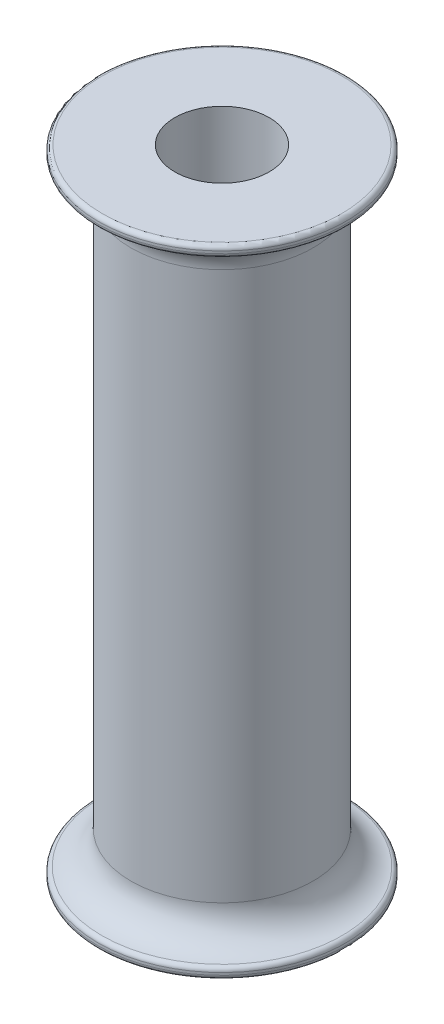
ISO-10303-21;
HEADER;
FILE_DESCRIPTION(('STEP AP214'),'2;1');
FILE_NAME('part.step','',(''),(''),'','','');
FILE_SCHEMA(('AUTOMOTIVE_DESIGN { 1 0 10303 214 1 1 1 1 }'));
ENDSEC;
DATA;
#1=APPLICATION_CONTEXT('core data for automotive mechanical design processes');
#2=APPLICATION_PROTOCOL_DEFINITION('international standard','automotive_design',2000,#1);
#3=PRODUCT_CONTEXT('',#1,'mechanical');
#4=PRODUCT('Part','Part','',(#3));
#5=PRODUCT_RELATED_PRODUCT_CATEGORY('part','',(#4));
#6=PRODUCT_DEFINITION_FORMATION('','',#4);
#7=PRODUCT_DEFINITION_CONTEXT('part definition',#1,'design');
#8=PRODUCT_DEFINITION('design','',#6,#7);
#9=PRODUCT_DEFINITION_SHAPE('','',#8);
#10=(LENGTH_UNIT() NAMED_UNIT(*) SI_UNIT(.MILLI.,.METRE.));
#11=(NAMED_UNIT(*) PLANE_ANGLE_UNIT() SI_UNIT($,.RADIAN.));
#12=(NAMED_UNIT(*) SI_UNIT($,.STERADIAN.) SOLID_ANGLE_UNIT());
#13=UNCERTAINTY_MEASURE_WITH_UNIT(LENGTH_MEASURE(1.E-05),#10,'distance_accuracy_value','');
#14=(GEOMETRIC_REPRESENTATION_CONTEXT(3) GLOBAL_UNCERTAINTY_ASSIGNED_CONTEXT((#13)) GLOBAL_UNIT_ASSIGNED_CONTEXT((#10,
#11,#12)) REPRESENTATION_CONTEXT('',''));
#15=CARTESIAN_POINT('',(0.,0.,0.));
#16=DIRECTION('',(0.,0.,1.));
#17=DIRECTION('',(1.,0.,0.));
#18=AXIS2_PLACEMENT_3D('',#15,#16,#17);
#19=CARTESIAN_POINT('',(0.,12.5,2.15));
#20=DIRECTION('',(0.,-1.,0.));
#21=DIRECTION('',(0.,0.,-1.));
#22=AXIS2_PLACEMENT_3D('',#19,#20,#21);
#23=TOROIDAL_SURFACE('',#22,5.65,1.5);
#24=CARTESIAN_POINT('',(0.,13.9895832073059,2.15));
#25=DIRECTION('',(0.,-1.,0.));
#26=DIRECTION('',(0.,0.,-1.));
#27=AXIS2_PLACEMENT_3D('',#24,#25,#26);
#28=CIRCLE('',#27,5.4735294117647);
#29=CARTESIAN_POINT('',(0.,13.9895832073059,-3.3235294117647));
#30=VERTEX_POINT('',#29);
#31=EDGE_CURVE('E60',#30,#30,#28,.T.);
#32=ORIENTED_EDGE('',*,*,#31,.T.);
#33=EDGE_LOOP('',(#32));
#34=FACE_BOUND('',#33,.T.);
#35=CARTESIAN_POINT('',(0.,12.5,2.15));
#36=DIRECTION('',(0.,-1.,0.));
#37=DIRECTION('',(0.,0.,-1.));
#38=AXIS2_PLACEMENT_3D('',#35,#36,#37);
#39=CIRCLE('',#38,4.15);
#40=CARTESIAN_POINT('',(0.,12.5,-2.));
#41=VERTEX_POINT('',#40);
#42=EDGE_CURVE('E63',#41,#41,#39,.T.);
#43=ORIENTED_EDGE('',*,*,#42,.F.);
#44=EDGE_LOOP('',(#43));
#45=FACE_BOUND('',#44,.T.);
#46=ADVANCED_FACE('F31',(#34,#45),#23,.F.);
#47=CARTESIAN_POINT('',(0.,0.,2.15));
#48=DIRECTION('',(0.,-1.,0.));
#49=DIRECTION('',(0.,0.,-1.));
#50=AXIS2_PLACEMENT_3D('',#47,#48,#49);
#51=CYLINDRICAL_SURFACE('',#50,4.15);
#52=ORIENTED_EDGE('',*,*,#42,.T.);
#53=EDGE_LOOP('',(#52));
#54=FACE_BOUND('',#53,.T.);
#55=CARTESIAN_POINT('',(0.,-12.5,2.15));
#56=DIRECTION('',(0.,-1.,0.));
#57=DIRECTION('',(0.,0.,-1.));
#58=AXIS2_PLACEMENT_3D('',#55,#56,#57);
#59=CIRCLE('',#58,4.15);
#60=CARTESIAN_POINT('',(0.,-12.5,-2.));
#61=VERTEX_POINT('',#60);
#62=EDGE_CURVE('E66',#61,#61,#59,.T.);
#63=ORIENTED_EDGE('',*,*,#62,.F.);
#64=EDGE_LOOP('',(#63));
#65=FACE_BOUND('',#64,.T.);
#66=ADVANCED_FACE('F94',(#54,#65),#51,.T.);
#67=CARTESIAN_POINT('',(0.,-12.5,2.15));
#68=DIRECTION('',(0.,-1.,0.));
#69=DIRECTION('',(0.,0.,-1.));
#70=AXIS2_PLACEMENT_3D('',#67,#68,#69);
#71=TOROIDAL_SURFACE('',#70,5.65,1.5);
#72=CARTESIAN_POINT('',(0.,-13.9895832073058,2.15));
#73=DIRECTION('',(0.,1.,0.));
#74=DIRECTION('',(0.,0.,1.));
#75=AXIS2_PLACEMENT_3D('',#72,#73,#74);
#76=CIRCLE('',#75,5.47352941176473);
#77=CARTESIAN_POINT('',(0.,-13.9895832073058,7.62352941176472));
#78=VERTEX_POINT('',#77);
#79=EDGE_CURVE('E10',#78,#78,#76,.T.);
#80=ORIENTED_EDGE('',*,*,#79,.T.);
#81=EDGE_LOOP('',(#80));
#82=FACE_BOUND('',#81,.T.);
#83=ORIENTED_EDGE('',*,*,#62,.T.);
#84=EDGE_LOOP('',(#83));
#85=FACE_BOUND('',#84,.T.);
#86=ADVANCED_FACE('F100',(#82,#85),#71,.F.);
#87=CARTESIAN_POINT('',(0.,0.,2.15));
#88=DIRECTION('',(0.,-1.,0.));
#89=DIRECTION('',(0.,0.,-1.));
#90=AXIS2_PLACEMENT_3D('',#87,#88,#89);
#91=CYLINDRICAL_SURFACE('',#90,5.65);
#92=CARTESIAN_POINT('',(0.,-14.3,2.15));
#93=DIRECTION('',(0.,-1.,0.));
#94=DIRECTION('',(0.,0.,-1.));
#95=AXIS2_PLACEMENT_3D('',#92,#93,#94);
#96=CIRCLE('',#95,5.65);
#97=CARTESIAN_POINT('',(0.,-14.3,-3.5));
#98=VERTEX_POINT('',#97);
#99=EDGE_CURVE('E38',#98,#98,#96,.F.);
#100=ORIENTED_EDGE('',*,*,#99,.T.);
#101=EDGE_LOOP('',(#100));
#102=FACE_BOUND('',#101,.T.);
#103=CARTESIAN_POINT('',(0.,-14.1881943016134,2.15));
#104=DIRECTION('',(0.,1.,0.));
#105=DIRECTION('',(0.,0.,1.));
#106=AXIS2_PLACEMENT_3D('',#103,#104,#105);
#107=CIRCLE('',#106,5.65);
#108=CARTESIAN_POINT('',(0.,-14.1881943016134,7.8));
#109=VERTEX_POINT('',#108);
#110=EDGE_CURVE('E42',#109,#109,#107,.F.);
#111=ORIENTED_EDGE('',*,*,#110,.T.);
#112=EDGE_LOOP('',(#111));
#113=FACE_BOUND('',#112,.T.);
#114=ADVANCED_FACE('F90',(#102,#113),#91,.T.);
#115=CARTESIAN_POINT('',(0.,-14.5,-3.5));
#116=DIRECTION('',(0.,-1.,0.));
#117=DIRECTION('',(0.,0.,-1.));
#118=AXIS2_PLACEMENT_3D('',#115,#116,#117);
#119=PLANE('',#118);
#120=CARTESIAN_POINT('',(0.,-14.5,2.15));
#121=DIRECTION('',(0.,-1.,0.));
#122=DIRECTION('',(0.,0.,-1.));
#123=AXIS2_PLACEMENT_3D('',#120,#121,#122);
#124=CIRCLE('',#123,5.45);
#125=CARTESIAN_POINT('',(0.,-14.5,-3.3));
#126=VERTEX_POINT('',#125);
#127=EDGE_CURVE('E46',#126,#126,#124,.T.);
#128=ORIENTED_EDGE('',*,*,#127,.T.);
#129=EDGE_LOOP('',(#128));
#130=FACE_BOUND('',#129,.T.);
#131=CARTESIAN_POINT('',(0.,-14.5,2.15));
#132=DIRECTION('',(0.,-1.,0.));
#133=DIRECTION('',(0.,0.,-1.));
#134=AXIS2_PLACEMENT_3D('',#131,#132,#133);
#135=CIRCLE('',#134,2.15);
#136=CARTESIAN_POINT('',(0.,-14.5,0.));
#137=VERTEX_POINT('',#136);
#138=EDGE_CURVE('E69',#137,#137,#135,.T.);
#139=ORIENTED_EDGE('',*,*,#138,.F.);
#140=EDGE_LOOP('',(#139));
#141=FACE_BOUND('',#140,.T.);
#142=ADVANCED_FACE('F80',(#130,#141),#119,.T.);
#143=CARTESIAN_POINT('',(0.,0.,2.15));
#144=DIRECTION('',(0.,-1.,0.));
#145=DIRECTION('',(0.,0.,-1.));
#146=AXIS2_PLACEMENT_3D('',#143,#144,#145);
#147=CYLINDRICAL_SURFACE('',#146,2.15);
#148=ORIENTED_EDGE('',*,*,#138,.T.);
#149=EDGE_LOOP('',(#148));
#150=FACE_BOUND('',#149,.T.);
#151=CARTESIAN_POINT('',(0.,14.5,2.15));
#152=DIRECTION('',(0.,-1.,0.));
#153=DIRECTION('',(0.,0.,-1.));
#154=AXIS2_PLACEMENT_3D('',#151,#152,#153);
#155=CIRCLE('',#154,2.15);
#156=CARTESIAN_POINT('',(0.,14.5,0.));
#157=VERTEX_POINT('',#156);
#158=EDGE_CURVE('E72',#157,#157,#155,.T.);
#159=ORIENTED_EDGE('',*,*,#158,.F.);
#160=EDGE_LOOP('',(#159));
#161=FACE_BOUND('',#160,.T.);
#162=ADVANCED_FACE('F78',(#150,#161),#147,.F.);
#163=CARTESIAN_POINT('',(0.,14.5,-3.5));
#164=DIRECTION('',(0.,1.,0.));
#165=DIRECTION('',(0.,0.,1.));
#166=AXIS2_PLACEMENT_3D('',#163,#164,#165);
#167=PLANE('',#166);
#168=CARTESIAN_POINT('',(0.,14.5,2.15));
#169=DIRECTION('',(0.,1.,0.));
#170=DIRECTION('',(0.,0.,1.));
#171=AXIS2_PLACEMENT_3D('',#168,#169,#170);
#172=CIRCLE('',#171,5.45);
#173=CARTESIAN_POINT('',(0.,14.5,7.6));
#174=VERTEX_POINT('',#173);
#175=EDGE_CURVE('E51',#174,#174,#172,.T.);
#176=ORIENTED_EDGE('',*,*,#175,.T.);
#177=EDGE_LOOP('',(#176));
#178=FACE_BOUND('',#177,.T.);
#179=ORIENTED_EDGE('',*,*,#158,.T.);
#180=EDGE_LOOP('',(#179));
#181=FACE_BOUND('',#180,.T.);
#182=ADVANCED_FACE('F76',(#178,#181),#167,.T.);
#183=CARTESIAN_POINT('',(0.,0.,2.15));
#184=DIRECTION('',(0.,-1.,0.));
#185=DIRECTION('',(0.,0.,-1.));
#186=AXIS2_PLACEMENT_3D('',#183,#184,#185);
#187=CYLINDRICAL_SURFACE('',#186,5.65);
#188=CARTESIAN_POINT('',(0.,14.1881943016134,2.15));
#189=DIRECTION('',(0.,1.,0.));
#190=DIRECTION('',(0.,0.,1.));
#191=AXIS2_PLACEMENT_3D('',#188,#189,#190);
#192=CIRCLE('',#191,5.65);
#193=CARTESIAN_POINT('',(0.,14.1881943016134,7.8));
#194=VERTEX_POINT('',#193);
#195=EDGE_CURVE('E54',#194,#194,#192,.T.);
#196=ORIENTED_EDGE('',*,*,#195,.T.);
#197=EDGE_LOOP('',(#196));
#198=FACE_BOUND('',#197,.T.);
#199=CARTESIAN_POINT('',(0.,14.3,2.15));
#200=DIRECTION('',(0.,1.,0.));
#201=DIRECTION('',(0.,0.,1.));
#202=AXIS2_PLACEMENT_3D('',#199,#200,#201);
#203=CIRCLE('',#202,5.65);
#204=CARTESIAN_POINT('',(0.,14.3,7.8));
#205=VERTEX_POINT('',#204);
#206=EDGE_CURVE('E57',#205,#205,#203,.F.);
#207=ORIENTED_EDGE('',*,*,#206,.T.);
#208=EDGE_LOOP('',(#207));
#209=FACE_BOUND('',#208,.T.);
#210=ADVANCED_FACE('F87',(#198,#209),#187,.T.);
#211=CARTESIAN_POINT('',(0.,14.1881943016134,2.15));
#212=DIRECTION('',(0.,1.,0.));
#213=DIRECTION('',(0.,0.,1.));
#214=AXIS2_PLACEMENT_3D('',#211,#212,#213);
#215=TOROIDAL_SURFACE('',#214,5.45,0.2);
#216=ORIENTED_EDGE('',*,*,#195,.F.);
#217=EDGE_LOOP('',(#216));
#218=FACE_BOUND('',#217,.T.);
#219=ORIENTED_EDGE('',*,*,#31,.F.);
#220=EDGE_LOOP('',(#219));
#221=FACE_BOUND('',#220,.T.);
#222=ADVANCED_FACE('F106',(#218,#221),#215,.T.);
#223=CARTESIAN_POINT('',(0.,14.3,2.15));
#224=DIRECTION('',(0.,1.,0.));
#225=DIRECTION('',(0.,0.,1.));
#226=AXIS2_PLACEMENT_3D('',#223,#224,#225);
#227=TOROIDAL_SURFACE('',#226,5.45,0.2);
#228=ORIENTED_EDGE('',*,*,#175,.F.);
#229=EDGE_LOOP('',(#228));
#230=FACE_BOUND('',#229,.T.);
#231=ORIENTED_EDGE('',*,*,#206,.F.);
#232=EDGE_LOOP('',(#231));
#233=FACE_BOUND('',#232,.T.);
#234=ADVANCED_FACE('F109',(#230,#233),#227,.T.);
#235=CARTESIAN_POINT('',(0.,-14.3,2.15));
#236=DIRECTION('',(0.,-1.,0.));
#237=DIRECTION('',(0.,0.,-1.));
#238=AXIS2_PLACEMENT_3D('',#235,#236,#237);
#239=TOROIDAL_SURFACE('',#238,5.45,0.2);
#240=ORIENTED_EDGE('',*,*,#99,.F.);
#241=EDGE_LOOP('',(#240));
#242=FACE_BOUND('',#241,.T.);
#243=ORIENTED_EDGE('',*,*,#127,.F.);
#244=EDGE_LOOP('',(#243));
#245=FACE_BOUND('',#244,.T.);
#246=ADVANCED_FACE('F112',(#242,#245),#239,.T.);
#247=CARTESIAN_POINT('',(0.,-14.1881943016134,2.15));
#248=DIRECTION('',(0.,1.,0.));
#249=DIRECTION('',(0.,0.,1.));
#250=AXIS2_PLACEMENT_3D('',#247,#248,#249);
#251=TOROIDAL_SURFACE('',#250,5.45,0.2);
#252=ORIENTED_EDGE('',*,*,#79,.F.);
#253=EDGE_LOOP('',(#252));
#254=FACE_BOUND('',#253,.T.);
#255=ORIENTED_EDGE('',*,*,#110,.F.);
#256=EDGE_LOOP('',(#255));
#257=FACE_BOUND('',#256,.T.);
#258=ADVANCED_FACE('F33',(#254,#257),#251,.T.);
#259=CLOSED_SHELL('',(#46,#66,#86,#114,#142,#162,#182,#210,#222,#234,#246,#258));
#260=MANIFOLD_SOLID_BREP('B2',#259);
#261=ADVANCED_BREP_SHAPE_REPRESENTATION('',(#18,#260),#14);
#262=SHAPE_DEFINITION_REPRESENTATION(#9,#261);
ENDSEC;
END-ISO-10303-21;
